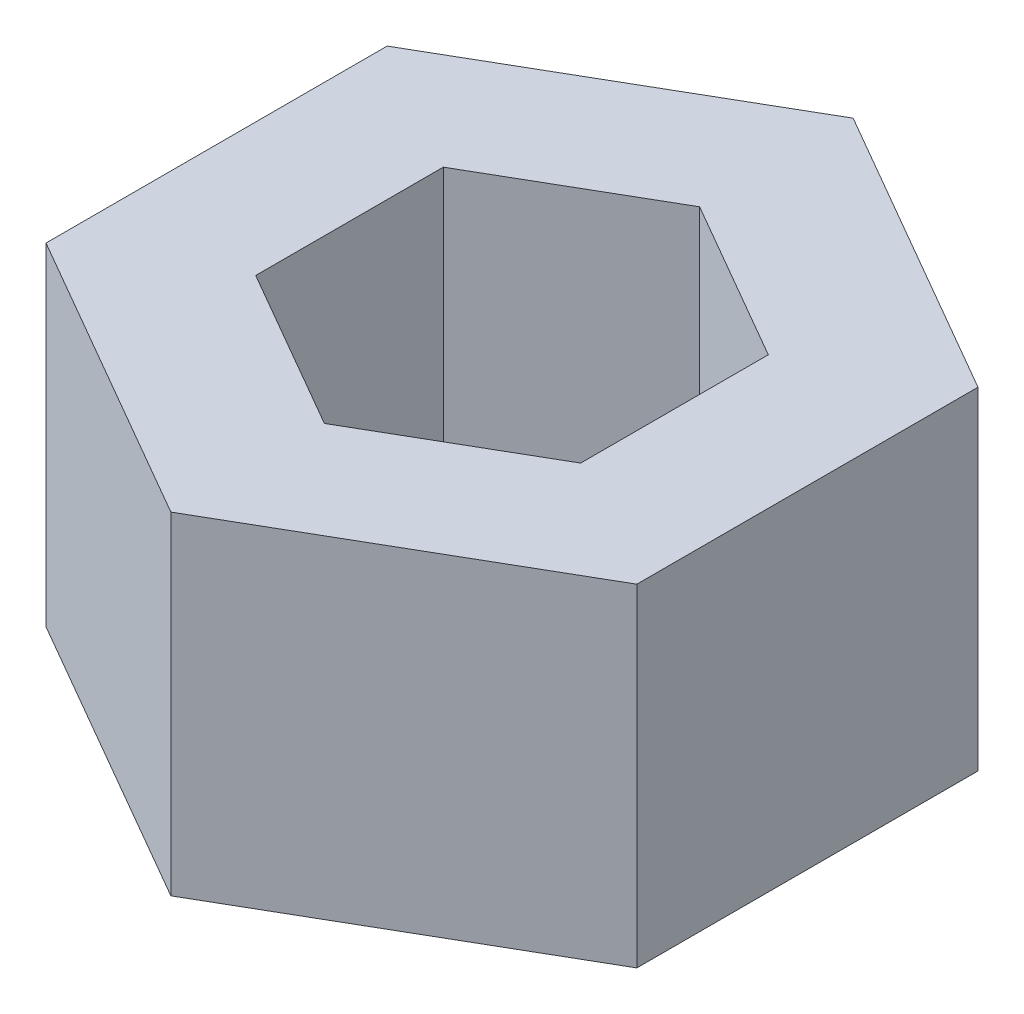
ISO-10303-21;
HEADER;
FILE_DESCRIPTION(('STEP AP214'),'2;1');
FILE_NAME('part.step','',(''),(''),'','','');
FILE_SCHEMA(('AUTOMOTIVE_DESIGN { 1 0 10303 214 1 1 1 1 }'));
ENDSEC;
DATA;
#1=APPLICATION_CONTEXT('core data for automotive mechanical design processes');
#2=APPLICATION_PROTOCOL_DEFINITION('international standard','automotive_design',2000,#1);
#3=PRODUCT_CONTEXT('',#1,'mechanical');
#4=PRODUCT('Part','Part','',(#3));
#5=PRODUCT_RELATED_PRODUCT_CATEGORY('part','',(#4));
#6=PRODUCT_DEFINITION_FORMATION('','',#4);
#7=PRODUCT_DEFINITION_CONTEXT('part definition',#1,'design');
#8=PRODUCT_DEFINITION('design','',#6,#7);
#9=PRODUCT_DEFINITION_SHAPE('','',#8);
#10=(LENGTH_UNIT() NAMED_UNIT(*) SI_UNIT(.MILLI.,.METRE.));
#11=(NAMED_UNIT(*) PLANE_ANGLE_UNIT() SI_UNIT($,.RADIAN.));
#12=(NAMED_UNIT(*) SI_UNIT($,.STERADIAN.) SOLID_ANGLE_UNIT());
#13=UNCERTAINTY_MEASURE_WITH_UNIT(LENGTH_MEASURE(1.E-05),#10,'distance_accuracy_value','');
#14=(GEOMETRIC_REPRESENTATION_CONTEXT(3) GLOBAL_UNCERTAINTY_ASSIGNED_CONTEXT((#13)) GLOBAL_UNIT_ASSIGNED_CONTEXT((#10,
#11,#12)) REPRESENTATION_CONTEXT('',''));
#15=CARTESIAN_POINT('',(0.,0.,0.));
#16=DIRECTION('',(0.,0.,1.));
#17=DIRECTION('',(1.,0.,0.));
#18=AXIS2_PLACEMENT_3D('',#15,#16,#17);
#19=CARTESIAN_POINT('',(0.,9.,0.));
#20=DIRECTION('',(0.,1.,0.));
#21=DIRECTION('',(0.,0.,1.));
#22=AXIS2_PLACEMENT_3D('',#19,#20,#21);
#23=PLANE('',#22);
#24=DIRECTION('',(0.866025403784439,0.,0.5));
#25=VECTOR('',#24,1.);
#26=CARTESIAN_POINT('',(-8.,9.,4.61880215351701));
#27=LINE('',#26,#25);
#28=CARTESIAN_POINT('',(-8.,9.,4.61880215351701));
#29=VERTEX_POINT('',#28);
#30=CARTESIAN_POINT('',(0.,9.,9.23760430703401));
#31=VERTEX_POINT('',#30);
#32=EDGE_CURVE('E179',#29,#31,#27,.T.);
#33=ORIENTED_EDGE('',*,*,#32,.T.);
#34=DIRECTION('',(0.866025403784439,0.,-0.5));
#35=VECTOR('',#34,1.);
#36=CARTESIAN_POINT('',(0.,9.,9.23760430703401));
#37=LINE('',#36,#35);
#38=CARTESIAN_POINT('',(8.,9.,4.61880215351701));
#39=VERTEX_POINT('',#38);
#40=EDGE_CURVE('E182',#31,#39,#37,.T.);
#41=ORIENTED_EDGE('',*,*,#40,.T.);
#42=DIRECTION('',(0.,0.,-1.));
#43=VECTOR('',#42,1.);
#44=CARTESIAN_POINT('',(8.,9.,4.61880215351701));
#45=LINE('',#44,#43);
#46=CARTESIAN_POINT('',(8.,9.,-4.61880215351701));
#47=VERTEX_POINT('',#46);
#48=EDGE_CURVE('E185',#39,#47,#45,.T.);
#49=ORIENTED_EDGE('',*,*,#48,.T.);
#50=DIRECTION('',(-0.866025403784439,0.,-0.5));
#51=VECTOR('',#50,1.);
#52=CARTESIAN_POINT('',(8.,9.,-4.61880215351701));
#53=LINE('',#52,#51);
#54=CARTESIAN_POINT('',(0.,9.,-9.23760430703402));
#55=VERTEX_POINT('',#54);
#56=EDGE_CURVE('E187',#47,#55,#53,.T.);
#57=ORIENTED_EDGE('',*,*,#56,.T.);
#58=DIRECTION('',(-0.866025403784439,0.,0.5));
#59=VECTOR('',#58,1.);
#60=CARTESIAN_POINT('',(0.,9.,-9.23760430703402));
#61=LINE('',#60,#59);
#62=CARTESIAN_POINT('',(-8.,9.,-4.61880215351701));
#63=VERTEX_POINT('',#62);
#64=EDGE_CURVE('E189',#55,#63,#61,.T.);
#65=ORIENTED_EDGE('',*,*,#64,.T.);
#66=DIRECTION('',(0.,0.,1.));
#67=VECTOR('',#66,1.);
#68=CARTESIAN_POINT('',(-8.,9.,-4.61880215351701));
#69=LINE('',#68,#67);
#70=EDGE_CURVE('E191',#63,#29,#69,.T.);
#71=ORIENTED_EDGE('',*,*,#70,.T.);
#72=EDGE_LOOP('',(#33,#41,#49,#57,#65,#71));
#73=FACE_BOUND('',#72,.T.);
#74=DIRECTION('',(0.866025403784439,0.,-0.5));
#75=VECTOR('',#74,1.);
#76=CARTESIAN_POINT('',(0.,9.,5.08068236886871));
#77=LINE('',#76,#75);
#78=CARTESIAN_POINT('',(0.,9.,5.08068236886871));
#79=VERTEX_POINT('',#78);
#80=CARTESIAN_POINT('',(4.4,9.,2.54034118443435));
#81=VERTEX_POINT('',#80);
#82=EDGE_CURVE('E136',#79,#81,#77,.T.);
#83=ORIENTED_EDGE('',*,*,#82,.F.);
#84=DIRECTION('',(0.866025403784439,0.,0.5));
#85=VECTOR('',#84,1.);
#86=CARTESIAN_POINT('',(-4.4,9.,2.54034118443435));
#87=LINE('',#86,#85);
#88=CARTESIAN_POINT('',(-4.4,9.,2.54034118443435));
#89=VERTEX_POINT('',#88);
#90=EDGE_CURVE('E128',#89,#79,#87,.T.);
#91=ORIENTED_EDGE('',*,*,#90,.F.);
#92=DIRECTION('',(0.,0.,1.));
#93=VECTOR('',#92,1.);
#94=CARTESIAN_POINT('',(-4.4,9.,-2.54034118443435));
#95=LINE('',#94,#93);
#96=CARTESIAN_POINT('',(-4.4,9.,-2.54034118443435));
#97=VERTEX_POINT('',#96);
#98=EDGE_CURVE('E157',#97,#89,#95,.T.);
#99=ORIENTED_EDGE('',*,*,#98,.F.);
#100=DIRECTION('',(-0.866025403784439,0.,0.5));
#101=VECTOR('',#100,1.);
#102=CARTESIAN_POINT('',(0.,9.,-5.08068236886871));
#103=LINE('',#102,#101);
#104=CARTESIAN_POINT('',(0.,9.,-5.08068236886871));
#105=VERTEX_POINT('',#104);
#106=EDGE_CURVE('E155',#105,#97,#103,.T.);
#107=ORIENTED_EDGE('',*,*,#106,.F.);
#108=DIRECTION('',(-0.866025403784439,0.,-0.5));
#109=VECTOR('',#108,1.);
#110=CARTESIAN_POINT('',(4.4,9.,-2.54034118443436));
#111=LINE('',#110,#109);
#112=CARTESIAN_POINT('',(4.4,9.,-2.54034118443436));
#113=VERTEX_POINT('',#112);
#114=EDGE_CURVE('E151',#113,#105,#111,.T.);
#115=ORIENTED_EDGE('',*,*,#114,.F.);
#116=DIRECTION('',(0.,0.,-1.));
#117=VECTOR('',#116,1.);
#118=CARTESIAN_POINT('',(4.4,9.,2.54034118443435));
#119=LINE('',#118,#117);
#120=EDGE_CURVE('E149',#81,#113,#119,.T.);
#121=ORIENTED_EDGE('',*,*,#120,.F.);
#122=EDGE_LOOP('',(#83,#91,#99,#107,#115,#121));
#123=FACE_BOUND('',#122,.T.);
#124=ADVANCED_FACE('F39',(#73,#123),#23,.T.);
#125=CARTESIAN_POINT('',(0.,0.,0.));
#126=DIRECTION('',(0.,1.,0.));
#127=DIRECTION('',(0.,0.,1.));
#128=AXIS2_PLACEMENT_3D('',#125,#126,#127);
#129=PLANE('',#128);
#130=DIRECTION('',(0.866025403784439,0.,0.5));
#131=VECTOR('',#130,1.);
#132=CARTESIAN_POINT('',(-8.,0.,4.61880215351701));
#133=LINE('',#132,#131);
#134=CARTESIAN_POINT('',(-8.,0.,4.61880215351701));
#135=VERTEX_POINT('',#134);
#136=CARTESIAN_POINT('',(0.,0.,9.23760430703401));
#137=VERTEX_POINT('',#136);
#138=EDGE_CURVE('E144',#135,#137,#133,.T.);
#139=ORIENTED_EDGE('',*,*,#138,.F.);
#140=DIRECTION('',(0.,0.,1.));
#141=VECTOR('',#140,1.);
#142=CARTESIAN_POINT('',(-8.,0.,-4.61880215351701));
#143=LINE('',#142,#141);
#144=CARTESIAN_POINT('',(-8.,0.,-4.61880215351701));
#145=VERTEX_POINT('',#144);
#146=EDGE_CURVE('E183',#145,#135,#143,.T.);
#147=ORIENTED_EDGE('',*,*,#146,.F.);
#148=DIRECTION('',(-0.866025403784439,0.,0.5));
#149=VECTOR('',#148,1.);
#150=CARTESIAN_POINT('',(0.,0.,-9.23760430703402));
#151=LINE('',#150,#149);
#152=CARTESIAN_POINT('',(0.,0.,-9.23760430703402));
#153=VERTEX_POINT('',#152);
#154=EDGE_CURVE('E202',#153,#145,#151,.T.);
#155=ORIENTED_EDGE('',*,*,#154,.F.);
#156=DIRECTION('',(-0.866025403784439,0.,-0.5));
#157=VECTOR('',#156,1.);
#158=CARTESIAN_POINT('',(8.,0.,-4.61880215351701));
#159=LINE('',#158,#157);
#160=CARTESIAN_POINT('',(8.,0.,-4.61880215351701));
#161=VERTEX_POINT('',#160);
#162=EDGE_CURVE('E200',#161,#153,#159,.T.);
#163=ORIENTED_EDGE('',*,*,#162,.F.);
#164=DIRECTION('',(0.,0.,-1.));
#165=VECTOR('',#164,1.);
#166=CARTESIAN_POINT('',(8.,0.,4.61880215351701));
#167=LINE('',#166,#165);
#168=CARTESIAN_POINT('',(8.,0.,4.61880215351701));
#169=VERTEX_POINT('',#168);
#170=EDGE_CURVE('E198',#169,#161,#167,.T.);
#171=ORIENTED_EDGE('',*,*,#170,.F.);
#172=DIRECTION('',(0.866025403784439,0.,-0.5));
#173=VECTOR('',#172,1.);
#174=CARTESIAN_POINT('',(0.,0.,9.23760430703401));
#175=LINE('',#174,#173);
#176=EDGE_CURVE('E196',#137,#169,#175,.T.);
#177=ORIENTED_EDGE('',*,*,#176,.F.);
#178=EDGE_LOOP('',(#139,#147,#155,#163,#171,#177));
#179=FACE_BOUND('',#178,.T.);
#180=DIRECTION('',(0.866025403784439,0.,0.5));
#181=VECTOR('',#180,1.);
#182=CARTESIAN_POINT('',(-4.4,0.,2.54034118443435));
#183=LINE('',#182,#181);
#184=CARTESIAN_POINT('',(-4.4,0.,2.54034118443435));
#185=VERTEX_POINT('',#184);
#186=CARTESIAN_POINT('',(0.,0.,5.08068236886871));
#187=VERTEX_POINT('',#186);
#188=EDGE_CURVE('E62',#185,#187,#183,.T.);
#189=ORIENTED_EDGE('',*,*,#188,.T.);
#190=DIRECTION('',(0.866025403784439,0.,-0.5));
#191=VECTOR('',#190,1.);
#192=CARTESIAN_POINT('',(0.,0.,5.08068236886871));
#193=LINE('',#192,#191);
#194=CARTESIAN_POINT('',(4.4,0.,2.54034118443435));
#195=VERTEX_POINT('',#194);
#196=EDGE_CURVE('E143',#187,#195,#193,.T.);
#197=ORIENTED_EDGE('',*,*,#196,.T.);
#198=DIRECTION('',(0.,0.,-1.));
#199=VECTOR('',#198,1.);
#200=CARTESIAN_POINT('',(4.4,0.,2.54034118443435));
#201=LINE('',#200,#199);
#202=CARTESIAN_POINT('',(4.4,0.,-2.54034118443436));
#203=VERTEX_POINT('',#202);
#204=EDGE_CURVE('E161',#195,#203,#201,.T.);
#205=ORIENTED_EDGE('',*,*,#204,.T.);
#206=DIRECTION('',(-0.866025403784439,0.,-0.5));
#207=VECTOR('',#206,1.);
#208=CARTESIAN_POINT('',(4.4,0.,-2.54034118443436));
#209=LINE('',#208,#207);
#210=CARTESIAN_POINT('',(0.,0.,-5.08068236886871));
#211=VERTEX_POINT('',#210);
#212=EDGE_CURVE('E164',#203,#211,#209,.T.);
#213=ORIENTED_EDGE('',*,*,#212,.T.);
#214=DIRECTION('',(-0.866025403784439,0.,0.5));
#215=VECTOR('',#214,1.);
#216=CARTESIAN_POINT('',(0.,0.,-5.08068236886871));
#217=LINE('',#216,#215);
#218=CARTESIAN_POINT('',(-4.4,0.,-2.54034118443435));
#219=VERTEX_POINT('',#218);
#220=EDGE_CURVE('E167',#211,#219,#217,.T.);
#221=ORIENTED_EDGE('',*,*,#220,.T.);
#222=DIRECTION('',(0.,0.,1.));
#223=VECTOR('',#222,1.);
#224=CARTESIAN_POINT('',(-4.4,0.,-2.54034118443435));
#225=LINE('',#224,#223);
#226=EDGE_CURVE('E137',#219,#185,#225,.T.);
#227=ORIENTED_EDGE('',*,*,#226,.T.);
#228=EDGE_LOOP('',(#189,#197,#205,#213,#221,#227));
#229=FACE_BOUND('',#228,.T.);
#230=ADVANCED_FACE('F226',(#179,#229),#129,.F.);
#231=CARTESIAN_POINT('',(-8.,9.,4.61880215351701));
#232=DIRECTION('',(0.5,0.,-0.866025403784439));
#233=DIRECTION('',(-0.866025403784439,0.,-0.5));
#234=AXIS2_PLACEMENT_3D('',#231,#232,#233);
#235=PLANE('',#234);
#236=ORIENTED_EDGE('',*,*,#138,.T.);
#237=DIRECTION('',(0.,-1.,0.));
#238=VECTOR('',#237,1.);
#239=CARTESIAN_POINT('',(0.,9.,9.23760430703401));
#240=LINE('',#239,#238);
#241=EDGE_CURVE('E11',#31,#137,#240,.T.);
#242=ORIENTED_EDGE('',*,*,#241,.F.);
#243=ORIENTED_EDGE('',*,*,#32,.F.);
#244=DIRECTION('',(0.,-1.,0.));
#245=VECTOR('',#244,1.);
#246=CARTESIAN_POINT('',(-8.,9.,4.61880215351701));
#247=LINE('',#246,#245);
#248=EDGE_CURVE('E193',#29,#135,#247,.T.);
#249=ORIENTED_EDGE('',*,*,#248,.T.);
#250=EDGE_LOOP('',(#236,#242,#243,#249));
#251=FACE_BOUND('',#250,.T.);
#252=ADVANCED_FACE('F41',(#251),#235,.F.);
#253=CARTESIAN_POINT('',(0.,9.,9.23760430703401));
#254=DIRECTION('',(-0.5,0.,-0.866025403784439));
#255=DIRECTION('',(-0.866025403784439,0.,0.5));
#256=AXIS2_PLACEMENT_3D('',#253,#254,#255);
#257=PLANE('',#256);
#258=ORIENTED_EDGE('',*,*,#176,.T.);
#259=DIRECTION('',(0.,-1.,0.));
#260=VECTOR('',#259,1.);
#261=CARTESIAN_POINT('',(8.,9.,4.61880215351701));
#262=LINE('',#261,#260);
#263=EDGE_CURVE('E47',#39,#169,#262,.T.);
#264=ORIENTED_EDGE('',*,*,#263,.F.);
#265=ORIENTED_EDGE('',*,*,#40,.F.);
#266=ORIENTED_EDGE('',*,*,#241,.T.);
#267=EDGE_LOOP('',(#258,#264,#265,#266));
#268=FACE_BOUND('',#267,.T.);
#269=ADVANCED_FACE('F243',(#268),#257,.F.);
#270=CARTESIAN_POINT('',(8.,9.,4.61880215351701));
#271=DIRECTION('',(-1.,0.,0.));
#272=DIRECTION('',(0.,0.,1.));
#273=AXIS2_PLACEMENT_3D('',#270,#271,#272);
#274=PLANE('',#273);
#275=ORIENTED_EDGE('',*,*,#170,.T.);
#276=DIRECTION('',(0.,-1.,0.));
#277=VECTOR('',#276,1.);
#278=CARTESIAN_POINT('',(8.,9.,-4.61880215351701));
#279=LINE('',#278,#277);
#280=EDGE_CURVE('E213',#47,#161,#279,.T.);
#281=ORIENTED_EDGE('',*,*,#280,.F.);
#282=ORIENTED_EDGE('',*,*,#48,.F.);
#283=ORIENTED_EDGE('',*,*,#263,.T.);
#284=EDGE_LOOP('',(#275,#281,#282,#283));
#285=FACE_BOUND('',#284,.T.);
#286=ADVANCED_FACE('F220',(#285),#274,.F.);
#287=CARTESIAN_POINT('',(8.,9.,-4.61880215351701));
#288=DIRECTION('',(-0.5,0.,0.866025403784439));
#289=DIRECTION('',(0.866025403784439,0.,0.5));
#290=AXIS2_PLACEMENT_3D('',#287,#288,#289);
#291=PLANE('',#290);
#292=ORIENTED_EDGE('',*,*,#162,.T.);
#293=DIRECTION('',(0.,-1.,0.));
#294=VECTOR('',#293,1.);
#295=CARTESIAN_POINT('',(0.,9.,-9.23760430703402));
#296=LINE('',#295,#294);
#297=EDGE_CURVE('E210',#55,#153,#296,.T.);
#298=ORIENTED_EDGE('',*,*,#297,.F.);
#299=ORIENTED_EDGE('',*,*,#56,.F.);
#300=ORIENTED_EDGE('',*,*,#280,.T.);
#301=EDGE_LOOP('',(#292,#298,#299,#300));
#302=FACE_BOUND('',#301,.T.);
#303=ADVANCED_FACE('F232',(#302),#291,.F.);
#304=CARTESIAN_POINT('',(0.,9.,-9.23760430703402));
#305=DIRECTION('',(0.5,0.,0.866025403784439));
#306=DIRECTION('',(0.866025403784439,0.,-0.5));
#307=AXIS2_PLACEMENT_3D('',#304,#305,#306);
#308=PLANE('',#307);
#309=ORIENTED_EDGE('',*,*,#154,.T.);
#310=DIRECTION('',(0.,-1.,0.));
#311=VECTOR('',#310,1.);
#312=CARTESIAN_POINT('',(-8.,9.,-4.61880215351701));
#313=LINE('',#312,#311);
#314=EDGE_CURVE('E207',#63,#145,#313,.T.);
#315=ORIENTED_EDGE('',*,*,#314,.F.);
#316=ORIENTED_EDGE('',*,*,#64,.F.);
#317=ORIENTED_EDGE('',*,*,#297,.T.);
#318=EDGE_LOOP('',(#309,#315,#316,#317));
#319=FACE_BOUND('',#318,.T.);
#320=ADVANCED_FACE('F236',(#319),#308,.F.);
#321=CARTESIAN_POINT('',(-8.,9.,-4.61880215351701));
#322=DIRECTION('',(1.,0.,0.));
#323=DIRECTION('',(0.,0.,-1.));
#324=AXIS2_PLACEMENT_3D('',#321,#322,#323);
#325=PLANE('',#324);
#326=ORIENTED_EDGE('',*,*,#146,.T.);
#327=ORIENTED_EDGE('',*,*,#248,.F.);
#328=ORIENTED_EDGE('',*,*,#70,.F.);
#329=ORIENTED_EDGE('',*,*,#314,.T.);
#330=EDGE_LOOP('',(#326,#327,#328,#329));
#331=FACE_BOUND('',#330,.T.);
#332=ADVANCED_FACE('F246',(#331),#325,.F.);
#333=CARTESIAN_POINT('',(-4.4,9.,2.54034118443435));
#334=DIRECTION('',(0.5,0.,-0.866025403784439));
#335=DIRECTION('',(-0.866025403784439,0.,-0.5));
#336=AXIS2_PLACEMENT_3D('',#333,#334,#335);
#337=PLANE('',#336);
#338=ORIENTED_EDGE('',*,*,#188,.F.);
#339=DIRECTION('',(0.,-1.,0.));
#340=VECTOR('',#339,1.);
#341=CARTESIAN_POINT('',(-4.4,9.,2.54034118443435));
#342=LINE('',#341,#340);
#343=EDGE_CURVE('E132',#89,#185,#342,.T.);
#344=ORIENTED_EDGE('',*,*,#343,.F.);
#345=ORIENTED_EDGE('',*,*,#90,.T.);
#346=DIRECTION('',(0.,-1.,0.));
#347=VECTOR('',#346,1.);
#348=CARTESIAN_POINT('',(0.,9.,5.08068236886871));
#349=LINE('',#348,#347);
#350=EDGE_CURVE('E131',#79,#187,#349,.T.);
#351=ORIENTED_EDGE('',*,*,#350,.T.);
#352=EDGE_LOOP('',(#338,#344,#345,#351));
#353=FACE_BOUND('',#352,.T.);
#354=ADVANCED_FACE('F130',(#353),#337,.T.);
#355=CARTESIAN_POINT('',(0.,9.,5.08068236886871));
#356=DIRECTION('',(-0.5,0.,-0.866025403784439));
#357=DIRECTION('',(-0.866025403784439,0.,0.5));
#358=AXIS2_PLACEMENT_3D('',#355,#356,#357);
#359=PLANE('',#358);
#360=ORIENTED_EDGE('',*,*,#196,.F.);
#361=ORIENTED_EDGE('',*,*,#350,.F.);
#362=ORIENTED_EDGE('',*,*,#82,.T.);
#363=DIRECTION('',(0.,-1.,0.));
#364=VECTOR('',#363,1.);
#365=CARTESIAN_POINT('',(4.4,9.,2.54034118443435));
#366=LINE('',#365,#364);
#367=EDGE_CURVE('E145',#81,#195,#366,.T.);
#368=ORIENTED_EDGE('',*,*,#367,.T.);
#369=EDGE_LOOP('',(#360,#361,#362,#368));
#370=FACE_BOUND('',#369,.T.);
#371=ADVANCED_FACE('F140',(#370),#359,.T.);
#372=CARTESIAN_POINT('',(4.4,9.,2.54034118443435));
#373=DIRECTION('',(-1.,0.,0.));
#374=DIRECTION('',(0.,0.,1.));
#375=AXIS2_PLACEMENT_3D('',#372,#373,#374);
#376=PLANE('',#375);
#377=ORIENTED_EDGE('',*,*,#204,.F.);
#378=ORIENTED_EDGE('',*,*,#367,.F.);
#379=ORIENTED_EDGE('',*,*,#120,.T.);
#380=DIRECTION('',(0.,-1.,0.));
#381=VECTOR('',#380,1.);
#382=CARTESIAN_POINT('',(4.4,9.,-2.54034118443436));
#383=LINE('',#382,#381);
#384=EDGE_CURVE('E176',#113,#203,#383,.T.);
#385=ORIENTED_EDGE('',*,*,#384,.T.);
#386=EDGE_LOOP('',(#377,#378,#379,#385));
#387=FACE_BOUND('',#386,.T.);
#388=ADVANCED_FACE('F264',(#387),#376,.T.);
#389=CARTESIAN_POINT('',(4.4,9.,-2.54034118443436));
#390=DIRECTION('',(-0.5,0.,0.866025403784439));
#391=DIRECTION('',(0.866025403784439,0.,0.5));
#392=AXIS2_PLACEMENT_3D('',#389,#390,#391);
#393=PLANE('',#392);
#394=ORIENTED_EDGE('',*,*,#212,.F.);
#395=ORIENTED_EDGE('',*,*,#384,.F.);
#396=ORIENTED_EDGE('',*,*,#114,.T.);
#397=DIRECTION('',(0.,-1.,0.));
#398=VECTOR('',#397,1.);
#399=CARTESIAN_POINT('',(0.,9.,-5.08068236886871));
#400=LINE('',#399,#398);
#401=EDGE_CURVE('E174',#105,#211,#400,.T.);
#402=ORIENTED_EDGE('',*,*,#401,.T.);
#403=EDGE_LOOP('',(#394,#395,#396,#402));
#404=FACE_BOUND('',#403,.T.);
#405=ADVANCED_FACE('F267',(#404),#393,.T.);
#406=CARTESIAN_POINT('',(0.,9.,-5.08068236886871));
#407=DIRECTION('',(0.5,0.,0.866025403784439));
#408=DIRECTION('',(0.866025403784439,0.,-0.5));
#409=AXIS2_PLACEMENT_3D('',#406,#407,#408);
#410=PLANE('',#409);
#411=ORIENTED_EDGE('',*,*,#220,.F.);
#412=ORIENTED_EDGE('',*,*,#401,.F.);
#413=ORIENTED_EDGE('',*,*,#106,.T.);
#414=DIRECTION('',(0.,-1.,0.));
#415=VECTOR('',#414,1.);
#416=CARTESIAN_POINT('',(-4.4,9.,-2.54034118443435));
#417=LINE('',#416,#415);
#418=EDGE_CURVE('E54',#97,#219,#417,.T.);
#419=ORIENTED_EDGE('',*,*,#418,.T.);
#420=EDGE_LOOP('',(#411,#412,#413,#419));
#421=FACE_BOUND('',#420,.T.);
#422=ADVANCED_FACE('F271',(#421),#410,.T.);
#423=CARTESIAN_POINT('',(-4.4,9.,-2.54034118443435));
#424=DIRECTION('',(1.,0.,0.));
#425=DIRECTION('',(0.,0.,-1.));
#426=AXIS2_PLACEMENT_3D('',#423,#424,#425);
#427=PLANE('',#426);
#428=ORIENTED_EDGE('',*,*,#226,.F.);
#429=ORIENTED_EDGE('',*,*,#418,.F.);
#430=ORIENTED_EDGE('',*,*,#98,.T.);
#431=ORIENTED_EDGE('',*,*,#343,.T.);
#432=EDGE_LOOP('',(#428,#429,#430,#431));
#433=FACE_BOUND('',#432,.T.);
#434=ADVANCED_FACE('F275',(#433),#427,.T.);
#435=CLOSED_SHELL('',(#124,#230,#252,#269,#286,#303,#320,#332,#354,#371,#388,#405,#422,#434));
#436=MANIFOLD_SOLID_BREP('B2',#435);
#437=ADVANCED_BREP_SHAPE_REPRESENTATION('',(#18,#436),#14);
#438=SHAPE_DEFINITION_REPRESENTATION(#9,#437);
ENDSEC;
END-ISO-10303-21;
